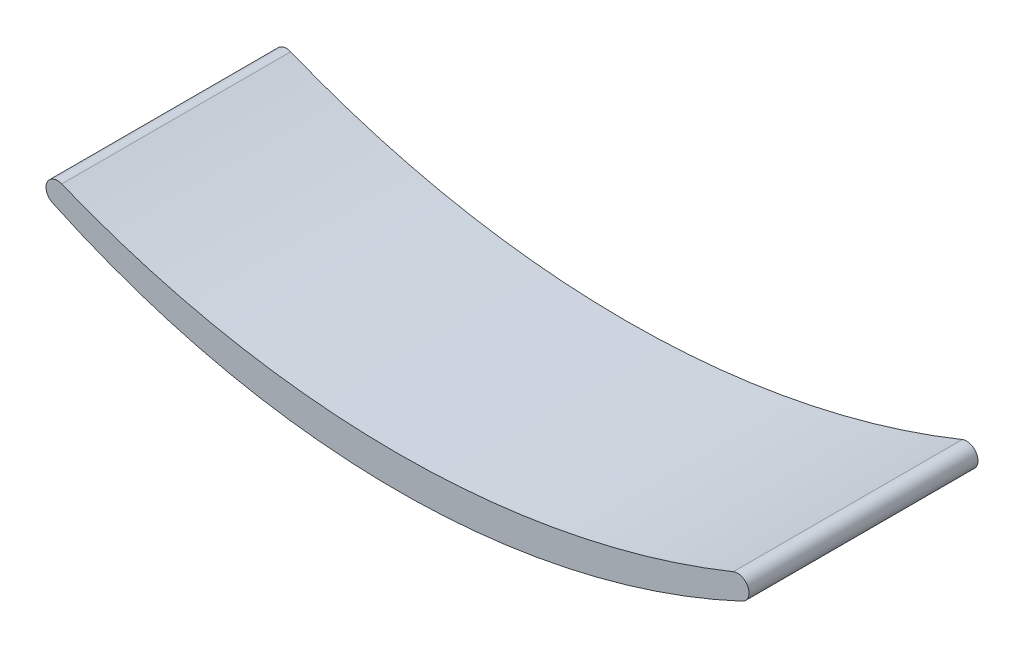
ISO-10303-21;
HEADER;
FILE_DESCRIPTION(('STEP AP214'),'2;1');
FILE_NAME('part.step','',(''),(''),'','','');
FILE_SCHEMA(('AUTOMOTIVE_DESIGN { 1 0 10303 214 1 1 1 1 }'));
ENDSEC;
DATA;
#1=APPLICATION_CONTEXT('core data for automotive mechanical design processes');
#2=APPLICATION_PROTOCOL_DEFINITION('international standard','automotive_design',2000,#1);
#3=PRODUCT_CONTEXT('',#1,'mechanical');
#4=PRODUCT('Part','Part','',(#3));
#5=PRODUCT_RELATED_PRODUCT_CATEGORY('part','',(#4));
#6=PRODUCT_DEFINITION_FORMATION('','',#4);
#7=PRODUCT_DEFINITION_CONTEXT('part definition',#1,'design');
#8=PRODUCT_DEFINITION('design','',#6,#7);
#9=PRODUCT_DEFINITION_SHAPE('','',#8);
#10=(LENGTH_UNIT() NAMED_UNIT(*) SI_UNIT(.MILLI.,.METRE.));
#11=(NAMED_UNIT(*) PLANE_ANGLE_UNIT() SI_UNIT($,.RADIAN.));
#12=(NAMED_UNIT(*) SI_UNIT($,.STERADIAN.) SOLID_ANGLE_UNIT());
#13=UNCERTAINTY_MEASURE_WITH_UNIT(LENGTH_MEASURE(1.E-05),#10,'distance_accuracy_value','');
#14=(GEOMETRIC_REPRESENTATION_CONTEXT(3) GLOBAL_UNCERTAINTY_ASSIGNED_CONTEXT((#13)) GLOBAL_UNIT_ASSIGNED_CONTEXT((#10,
#11,#12)) REPRESENTATION_CONTEXT('',''));
#15=CARTESIAN_POINT('',(0.,0.,0.));
#16=DIRECTION('',(0.,0.,1.));
#17=DIRECTION('',(1.,0.,0.));
#18=AXIS2_PLACEMENT_3D('',#15,#16,#17);
#19=CARTESIAN_POINT('',(-29.7,6.61301395396687,10.));
#20=DIRECTION('',(0.,0.,-1.));
#21=DIRECTION('',(-1.,0.,0.));
#22=AXIS2_PLACEMENT_3D('',#19,#20,#21);
#23=CYLINDRICAL_SURFACE('',#22,1.);
#24=CARTESIAN_POINT('',(-29.7,6.61301395396687,-10.));
#25=DIRECTION('',(0.,0.,1.));
#26=DIRECTION('',(1.,0.,0.));
#27=AXIS2_PLACEMENT_3D('',#24,#25,#26);
#28=CIRCLE('',#27,1.);
#29=CARTESIAN_POINT('',(-29.3248534363499,7.5399794634555,-10.));
#30=VERTEX_POINT('',#29);
#31=CARTESIAN_POINT('',(-30.1242857142857,5.70748558188069,-10.));
#32=VERTEX_POINT('',#31);
#33=EDGE_CURVE('E111',#30,#32,#28,.T.);
#34=ORIENTED_EDGE('',*,*,#33,.T.);
#35=DIRECTION('',(0.,0.,-1.));
#36=VECTOR('',#35,1.);
#37=CARTESIAN_POINT('',(-30.1242857142857,5.70748558188069,10.));
#38=LINE('',#37,#36);
#39=CARTESIAN_POINT('',(-30.1242857142857,5.70748558188069,10.));
#40=VERTEX_POINT('',#39);
#41=EDGE_CURVE('E11',#40,#32,#38,.T.);
#42=ORIENTED_EDGE('',*,*,#41,.F.);
#43=CARTESIAN_POINT('',(-29.7,6.61301395396687,10.));
#44=DIRECTION('',(0.,0.,1.));
#45=DIRECTION('',(1.,0.,0.));
#46=AXIS2_PLACEMENT_3D('',#43,#44,#45);
#47=CIRCLE('',#46,1.);
#48=CARTESIAN_POINT('',(-29.3248534363499,7.5399794634555,10.));
#49=VERTEX_POINT('',#48);
#50=EDGE_CURVE('E100',#49,#40,#47,.T.);
#51=ORIENTED_EDGE('',*,*,#50,.F.);
#52=DIRECTION('',(0.,0.,-1.));
#53=VECTOR('',#52,1.);
#54=CARTESIAN_POINT('',(-29.3248534363499,7.5399794634555,10.));
#55=LINE('',#54,#53);
#56=EDGE_CURVE('E106',#49,#30,#55,.T.);
#57=ORIENTED_EDGE('',*,*,#56,.T.);
#58=EDGE_LOOP('',(#34,#42,#51,#57));
#59=FACE_BOUND('',#58,.T.);
#60=ADVANCED_FACE('F44',(#59),#23,.T.);
#61=CARTESIAN_POINT('',(0.,70.,10.));
#62=DIRECTION('',(0.,0.,-1.));
#63=DIRECTION('',(-1.,0.,0.));
#64=AXIS2_PLACEMENT_3D('',#61,#62,#63);
#65=CYLINDRICAL_SURFACE('',#64,71.);
#66=CARTESIAN_POINT('',(0.,70.,-10.));
#67=DIRECTION('',(0.,0.,1.));
#68=DIRECTION('',(1.,0.,0.));
#69=AXIS2_PLACEMENT_3D('',#66,#67,#68);
#70=CIRCLE('',#69,71.);
#71=CARTESIAN_POINT('',(30.1242857142857,5.70748558188068,-10.));
#72=VERTEX_POINT('',#71);
#73=EDGE_CURVE('E105',#32,#72,#70,.T.);
#74=ORIENTED_EDGE('',*,*,#73,.T.);
#75=DIRECTION('',(0.,0.,-1.));
#76=VECTOR('',#75,1.);
#77=CARTESIAN_POINT('',(30.1242857142857,5.70748558188068,10.));
#78=LINE('',#77,#76);
#79=CARTESIAN_POINT('',(30.1242857142857,5.70748558188068,10.));
#80=VERTEX_POINT('',#79);
#81=EDGE_CURVE('E53',#80,#72,#78,.T.);
#82=ORIENTED_EDGE('',*,*,#81,.F.);
#83=CARTESIAN_POINT('',(0.,70.,10.));
#84=DIRECTION('',(0.,0.,1.));
#85=DIRECTION('',(1.,0.,0.));
#86=AXIS2_PLACEMENT_3D('',#83,#84,#85);
#87=CIRCLE('',#86,71.);
#88=EDGE_CURVE('E95',#40,#80,#87,.T.);
#89=ORIENTED_EDGE('',*,*,#88,.F.);
#90=ORIENTED_EDGE('',*,*,#41,.T.);
#91=EDGE_LOOP('',(#74,#82,#89,#90));
#92=FACE_BOUND('',#91,.T.);
#93=ADVANCED_FACE('F102',(#92),#65,.T.);
#94=CARTESIAN_POINT('',(29.7,6.61301395396687,10.));
#95=DIRECTION('',(0.,0.,-1.));
#96=DIRECTION('',(-1.,0.,0.));
#97=AXIS2_PLACEMENT_3D('',#94,#95,#96);
#98=CYLINDRICAL_SURFACE('',#97,1.);
#99=CARTESIAN_POINT('',(29.7,6.61301395396687,-10.));
#100=DIRECTION('',(0.,0.,1.));
#101=DIRECTION('',(1.,0.,0.));
#102=AXIS2_PLACEMENT_3D('',#99,#100,#101);
#103=CIRCLE('',#102,1.);
#104=CARTESIAN_POINT('',(29.3248534363498,7.53997946345548,-10.));
#105=VERTEX_POINT('',#104);
#106=EDGE_CURVE('E80',#72,#105,#103,.T.);
#107=ORIENTED_EDGE('',*,*,#106,.T.);
#108=DIRECTION('',(0.,0.,-1.));
#109=VECTOR('',#108,1.);
#110=CARTESIAN_POINT('',(29.3248534363498,7.53997946345548,10.));
#111=LINE('',#110,#109);
#112=CARTESIAN_POINT('',(29.3248534363498,7.53997946345548,10.));
#113=VERTEX_POINT('',#112);
#114=EDGE_CURVE('E101',#113,#105,#111,.T.);
#115=ORIENTED_EDGE('',*,*,#114,.F.);
#116=CARTESIAN_POINT('',(29.7,6.61301395396687,10.));
#117=DIRECTION('',(0.,0.,1.));
#118=DIRECTION('',(1.,0.,0.));
#119=AXIS2_PLACEMENT_3D('',#116,#117,#118);
#120=CIRCLE('',#119,1.);
#121=EDGE_CURVE('E94',#80,#113,#120,.T.);
#122=ORIENTED_EDGE('',*,*,#121,.F.);
#123=ORIENTED_EDGE('',*,*,#81,.T.);
#124=EDGE_LOOP('',(#107,#115,#122,#123));
#125=FACE_BOUND('',#124,.T.);
#126=ADVANCED_FACE('F103',(#125),#98,.T.);
#127=CARTESIAN_POINT('',(0.,80.,10.));
#128=DIRECTION('',(0.,0.,-1.));
#129=DIRECTION('',(-1.,0.,0.));
#130=AXIS2_PLACEMENT_3D('',#127,#128,#129);
#131=CYLINDRICAL_SURFACE('',#130,78.1690578504043);
#132=CARTESIAN_POINT('',(0.,80.,-10.));
#133=DIRECTION('',(0.,0.,-1.));
#134=DIRECTION('',(1.,0.,0.));
#135=AXIS2_PLACEMENT_3D('',#132,#133,#134);
#136=CIRCLE('',#135,78.1690578504043);
#137=EDGE_CURVE('E82',#105,#30,#136,.T.);
#138=ORIENTED_EDGE('',*,*,#137,.T.);
#139=ORIENTED_EDGE('',*,*,#56,.F.);
#140=CARTESIAN_POINT('',(0.,80.,10.));
#141=DIRECTION('',(0.,0.,-1.));
#142=DIRECTION('',(1.,0.,0.));
#143=AXIS2_PLACEMENT_3D('',#140,#141,#142);
#144=CIRCLE('',#143,78.1690578504043);
#145=EDGE_CURVE('E64',#113,#49,#144,.T.);
#146=ORIENTED_EDGE('',*,*,#145,.F.);
#147=ORIENTED_EDGE('',*,*,#114,.T.);
#148=EDGE_LOOP('',(#138,#139,#146,#147));
#149=FACE_BOUND('',#148,.T.);
#150=ADVANCED_FACE('F128',(#149),#131,.F.);
#151=CARTESIAN_POINT('',(-14.85,38.3065069769834,10.));
#152=DIRECTION('',(0.,0.,1.));
#153=DIRECTION('',(1.,0.,0.));
#154=AXIS2_PLACEMENT_3D('',#151,#152,#153);
#155=PLANE('',#154);
#156=ORIENTED_EDGE('',*,*,#50,.T.);
#157=ORIENTED_EDGE('',*,*,#88,.T.);
#158=ORIENTED_EDGE('',*,*,#121,.T.);
#159=ORIENTED_EDGE('',*,*,#145,.T.);
#160=EDGE_LOOP('',(#156,#157,#158,#159));
#161=FACE_BOUND('',#160,.T.);
#162=ADVANCED_FACE('F93',(#161),#155,.T.);
#163=CARTESIAN_POINT('',(-14.85,38.3065069769834,-10.));
#164=DIRECTION('',(0.,0.,1.));
#165=DIRECTION('',(1.,0.,0.));
#166=AXIS2_PLACEMENT_3D('',#163,#164,#165);
#167=PLANE('',#166);
#168=ORIENTED_EDGE('',*,*,#33,.F.);
#169=ORIENTED_EDGE('',*,*,#137,.F.);
#170=ORIENTED_EDGE('',*,*,#106,.F.);
#171=ORIENTED_EDGE('',*,*,#73,.F.);
#172=EDGE_LOOP('',(#168,#169,#170,#171));
#173=FACE_BOUND('',#172,.T.);
#174=ADVANCED_FACE('F129',(#173),#167,.F.);
#175=CLOSED_SHELL('',(#60,#93,#126,#150,#162,#174));
#176=MANIFOLD_SOLID_BREP('B2',#175);
#177=ADVANCED_BREP_SHAPE_REPRESENTATION('',(#18,#176),#14);
#178=SHAPE_DEFINITION_REPRESENTATION(#9,#177);
ENDSEC;
END-ISO-10303-21;
